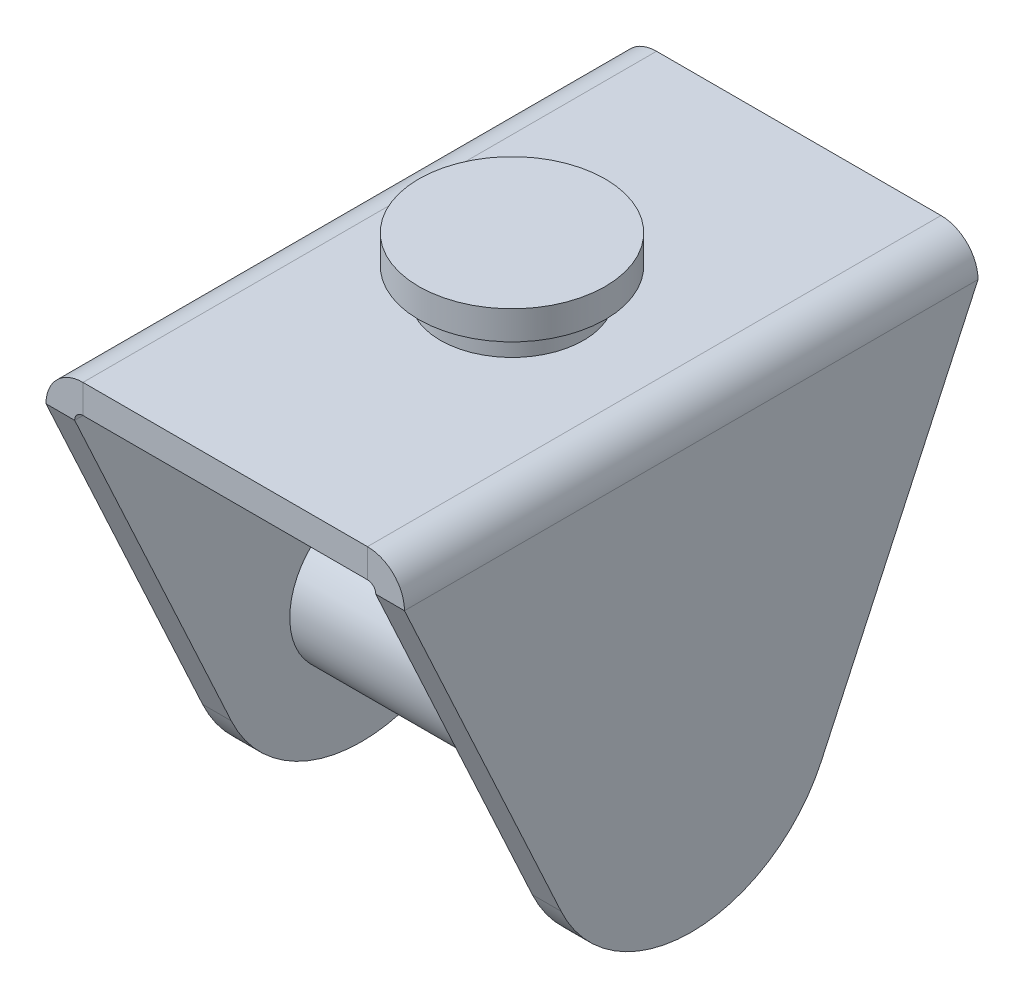
ISO-10303-21;
HEADER;
FILE_DESCRIPTION(('STEP AP214'),'2;1');
FILE_NAME('part.step','',(''),(''),'','','');
FILE_SCHEMA(('AUTOMOTIVE_DESIGN { 1 0 10303 214 1 1 1 1 }'));
ENDSEC;
DATA;
#1=APPLICATION_CONTEXT('core data for automotive mechanical design processes');
#2=APPLICATION_PROTOCOL_DEFINITION('international standard','automotive_design',2000,#1);
#3=PRODUCT_CONTEXT('',#1,'mechanical');
#4=PRODUCT('Part','Part','',(#3));
#5=PRODUCT_RELATED_PRODUCT_CATEGORY('part','',(#4));
#6=PRODUCT_DEFINITION_FORMATION('','',#4);
#7=PRODUCT_DEFINITION_CONTEXT('part definition',#1,'design');
#8=PRODUCT_DEFINITION('design','',#6,#7);
#9=PRODUCT_DEFINITION_SHAPE('','',#8);
#10=(LENGTH_UNIT() NAMED_UNIT(*) SI_UNIT(.MILLI.,.METRE.));
#11=(NAMED_UNIT(*) PLANE_ANGLE_UNIT() SI_UNIT($,.RADIAN.));
#12=(NAMED_UNIT(*) SI_UNIT($,.STERADIAN.) SOLID_ANGLE_UNIT());
#13=UNCERTAINTY_MEASURE_WITH_UNIT(LENGTH_MEASURE(1.E-05),#10,'distance_accuracy_value','');
#14=(GEOMETRIC_REPRESENTATION_CONTEXT(3) GLOBAL_UNCERTAINTY_ASSIGNED_CONTEXT((#13)) GLOBAL_UNIT_ASSIGNED_CONTEXT((#10,
#11,#12)) REPRESENTATION_CONTEXT('',''));
#15=CARTESIAN_POINT('',(0.,0.,0.));
#16=DIRECTION('',(0.,0.,1.));
#17=DIRECTION('',(1.,0.,0.));
#18=AXIS2_PLACEMENT_3D('',#15,#16,#17);
#19=CARTESIAN_POINT('',(15.875,0.,0.));
#20=DIRECTION('',(-1.,0.,0.));
#21=DIRECTION('',(0.,-1.,0.));
#22=AXIS2_PLACEMENT_3D('',#19,#20,#21);
#23=PLANE('',#22);
#24=CARTESIAN_POINT('',(15.8750000000001,-27.94,0.));
#25=DIRECTION('',(1.,0.,0.));
#26=DIRECTION('',(0.,1.,0.));
#27=AXIS2_PLACEMENT_3D('',#24,#25,#26);
#28=CIRCLE('',#27,12.7);
#29=CARTESIAN_POINT('',(15.8750000000001,-33.2713788236344,11.526768837749));
#30=VERTEX_POINT('',#29);
#31=CARTESIAN_POINT('',(15.8750000000001,-33.2713788236344,-11.526768837749));
#32=VERTEX_POINT('',#31);
#33=EDGE_CURVE('E306',#30,#32,#28,.T.);
#34=ORIENTED_EDGE('',*,*,#33,.T.);
#35=DIRECTION('',(0.,0.907619593523546,-0.419793608160191));
#36=VECTOR('',#35,1.);
#37=CARTESIAN_POINT('',(15.875,-10.2551520798875,-22.1722693755687));
#38=LINE('',#37,#36);
#39=CARTESIAN_POINT('',(15.875,-3.27659999999999,-25.4));
#40=VERTEX_POINT('',#39);
#41=EDGE_CURVE('E191',#32,#40,#38,.T.);
#42=ORIENTED_EDGE('',*,*,#41,.T.);
#43=DIRECTION('',(0.,0.,1.));
#44=VECTOR('',#43,1.);
#45=CARTESIAN_POINT('',(15.875,-3.27659999999999,-25.4));
#46=LINE('',#45,#44);
#47=CARTESIAN_POINT('',(15.875,-3.27659999999999,25.4));
#48=VERTEX_POINT('',#47);
#49=EDGE_CURVE('E234',#48,#40,#46,.F.);
#50=ORIENTED_EDGE('',*,*,#49,.F.);
#51=DIRECTION('',(0.,0.907619593523546,0.419793608160192));
#52=VECTOR('',#51,1.);
#53=CARTESIAN_POINT('',(15.875,-10.2551520798875,22.1722693755687));
#54=LINE('',#53,#52);
#55=EDGE_CURVE('E308',#30,#48,#54,.T.);
#56=ORIENTED_EDGE('',*,*,#55,.F.);
#57=EDGE_LOOP('',(#34,#42,#50,#56));
#58=FACE_BOUND('',#57,.T.);
#59=ADVANCED_FACE('F87',(#58),#23,.F.);
#60=CARTESIAN_POINT('',(13.335,0.,0.));
#61=DIRECTION('',(-1.,0.,0.));
#62=DIRECTION('',(0.,-1.,0.));
#63=AXIS2_PLACEMENT_3D('',#60,#61,#62);
#64=PLANE('',#63);
#65=CARTESIAN_POINT('',(13.3350000000001,-27.94,0.));
#66=DIRECTION('',(-1.,0.,0.));
#67=DIRECTION('',(0.,-1.,0.));
#68=AXIS2_PLACEMENT_3D('',#65,#66,#67);
#69=CIRCLE('',#68,6.35);
#70=CARTESIAN_POINT('',(13.3350000000001,-34.29,0.));
#71=VERTEX_POINT('',#70);
#72=EDGE_CURVE('E13',#71,#71,#69,.T.);
#73=ORIENTED_EDGE('',*,*,#72,.F.);
#74=EDGE_LOOP('',(#73));
#75=FACE_BOUND('',#74,.T.);
#76=DIRECTION('',(0.,-0.907619593523546,0.419793608160191));
#77=VECTOR('',#76,1.);
#78=CARTESIAN_POINT('',(13.335,-10.2551520798875,-22.1722693755687));
#79=LINE('',#78,#77);
#80=CARTESIAN_POINT('',(13.335,-3.2766,-25.4));
#81=VERTEX_POINT('',#80);
#82=CARTESIAN_POINT('',(13.335,-33.2713788236345,-11.526768837749));
#83=VERTEX_POINT('',#82);
#84=EDGE_CURVE('E296',#81,#83,#79,.T.);
#85=ORIENTED_EDGE('',*,*,#84,.T.);
#86=CARTESIAN_POINT('',(13.3350000000001,-27.94,0.));
#87=DIRECTION('',(-1.,0.,0.));
#88=DIRECTION('',(0.,-1.,0.));
#89=AXIS2_PLACEMENT_3D('',#86,#87,#88);
#90=CIRCLE('',#89,12.7);
#91=CARTESIAN_POINT('',(13.335,-33.2713788236345,11.526768837749));
#92=VERTEX_POINT('',#91);
#93=EDGE_CURVE('E293',#83,#92,#90,.T.);
#94=ORIENTED_EDGE('',*,*,#93,.T.);
#95=DIRECTION('',(0.,-0.907619593523546,-0.419793608160192));
#96=VECTOR('',#95,1.);
#97=CARTESIAN_POINT('',(13.335,-10.2551520798875,22.1722693755688));
#98=LINE('',#97,#96);
#99=CARTESIAN_POINT('',(13.335,-3.2766,25.4));
#100=VERTEX_POINT('',#99);
#101=EDGE_CURVE('E217',#100,#92,#98,.T.);
#102=ORIENTED_EDGE('',*,*,#101,.F.);
#103=DIRECTION('',(0.,0.,1.));
#104=VECTOR('',#103,1.);
#105=CARTESIAN_POINT('',(13.335,-3.2766,-25.4));
#106=LINE('',#105,#104);
#107=EDGE_CURVE('E240',#81,#100,#106,.T.);
#108=ORIENTED_EDGE('',*,*,#107,.F.);
#109=EDGE_LOOP('',(#85,#94,#102,#108));
#110=FACE_BOUND('',#109,.T.);
#111=ADVANCED_FACE('F366',(#75,#110),#64,.T.);
#112=CARTESIAN_POINT('',(-15.875,0.,0.));
#113=DIRECTION('',(1.,0.,0.));
#114=DIRECTION('',(0.,1.,0.));
#115=AXIS2_PLACEMENT_3D('',#112,#113,#114);
#116=PLANE('',#115);
#117=DIRECTION('',(0.,0.907619593523546,-0.419793608160191));
#118=VECTOR('',#117,1.);
#119=CARTESIAN_POINT('',(-15.8750000000002,-10.2551520798876,-22.1722693755687));
#120=LINE('',#119,#118);
#121=CARTESIAN_POINT('',(-15.8750000000002,-33.2713788236346,-11.526768837749));
#122=VERTEX_POINT('',#121);
#123=CARTESIAN_POINT('',(-15.8750000000003,-3.2766000000001,-25.4));
#124=VERTEX_POINT('',#123);
#125=EDGE_CURVE('E178',#122,#124,#120,.T.);
#126=ORIENTED_EDGE('',*,*,#125,.F.);
#127=CARTESIAN_POINT('',(-15.8750000000002,-27.9400000000001,0.));
#128=DIRECTION('',(1.,0.,0.));
#129=DIRECTION('',(0.,1.,0.));
#130=AXIS2_PLACEMENT_3D('',#127,#128,#129);
#131=CIRCLE('',#130,12.7);
#132=CARTESIAN_POINT('',(-15.8750000000002,-33.2713788236346,11.526768837749));
#133=VERTEX_POINT('',#132);
#134=EDGE_CURVE('E299',#133,#122,#131,.T.);
#135=ORIENTED_EDGE('',*,*,#134,.F.);
#136=DIRECTION('',(0.,0.907619593523546,0.419793608160192));
#137=VECTOR('',#136,1.);
#138=CARTESIAN_POINT('',(-15.8750000000002,-10.2551520798876,22.1722693755687));
#139=LINE('',#138,#137);
#140=CARTESIAN_POINT('',(-15.8750000000003,-3.2766000000001,25.4));
#141=VERTEX_POINT('',#140);
#142=EDGE_CURVE('E212',#133,#141,#139,.T.);
#143=ORIENTED_EDGE('',*,*,#142,.T.);
#144=DIRECTION('',(0.,0.,-1.));
#145=VECTOR('',#144,1.);
#146=CARTESIAN_POINT('',(-15.875,-3.27659999999999,25.4));
#147=LINE('',#146,#145);
#148=EDGE_CURVE('E196',#124,#141,#147,.F.);
#149=ORIENTED_EDGE('',*,*,#148,.F.);
#150=EDGE_LOOP('',(#126,#135,#143,#149));
#151=FACE_BOUND('',#150,.T.);
#152=ADVANCED_FACE('F210',(#151),#116,.F.);
#153=CARTESIAN_POINT('',(-13.335,0.,0.));
#154=DIRECTION('',(1.,0.,0.));
#155=DIRECTION('',(0.,1.,0.));
#156=AXIS2_PLACEMENT_3D('',#153,#154,#155);
#157=PLANE('',#156);
#158=CARTESIAN_POINT('',(-13.3350000000001,-27.9400000000001,0.));
#159=DIRECTION('',(1.,0.,0.));
#160=DIRECTION('',(0.,1.,0.));
#161=AXIS2_PLACEMENT_3D('',#158,#159,#160);
#162=CIRCLE('',#161,6.35);
#163=CARTESIAN_POINT('',(-13.3350000000001,-21.5900000000001,0.));
#164=VERTEX_POINT('',#163);
#165=EDGE_CURVE('E95',#164,#164,#162,.T.);
#166=ORIENTED_EDGE('',*,*,#165,.F.);
#167=EDGE_LOOP('',(#166));
#168=FACE_BOUND('',#167,.T.);
#169=CARTESIAN_POINT('',(-13.3350000000001,-27.9400000000001,0.));
#170=DIRECTION('',(1.,0.,0.));
#171=DIRECTION('',(0.,1.,0.));
#172=AXIS2_PLACEMENT_3D('',#169,#170,#171);
#173=CIRCLE('',#172,12.7);
#174=CARTESIAN_POINT('',(-13.3350000000001,-33.2713788236346,11.526768837749));
#175=VERTEX_POINT('',#174);
#176=CARTESIAN_POINT('',(-13.3350000000001,-33.2713788236346,-11.526768837749));
#177=VERTEX_POINT('',#176);
#178=EDGE_CURVE('E288',#175,#177,#173,.T.);
#179=ORIENTED_EDGE('',*,*,#178,.T.);
#180=DIRECTION('',(0.,0.907619593523546,-0.419793608160191));
#181=VECTOR('',#180,1.);
#182=CARTESIAN_POINT('',(-13.335,-10.2551520798875,-22.1722693755688));
#183=LINE('',#182,#181);
#184=CARTESIAN_POINT('',(-13.335,-3.27660000000009,-25.4));
#185=VERTEX_POINT('',#184);
#186=EDGE_CURVE('E290',#177,#185,#183,.T.);
#187=ORIENTED_EDGE('',*,*,#186,.T.);
#188=DIRECTION('',(0.,0.,-1.));
#189=VECTOR('',#188,1.);
#190=CARTESIAN_POINT('',(-13.335,-3.2766,25.4));
#191=LINE('',#190,#189);
#192=CARTESIAN_POINT('',(-13.3350000000001,-3.27660000000009,25.4));
#193=VERTEX_POINT('',#192);
#194=EDGE_CURVE('E207',#193,#185,#191,.T.);
#195=ORIENTED_EDGE('',*,*,#194,.F.);
#196=DIRECTION('',(0.,0.907619593523546,0.419793608160192));
#197=VECTOR('',#196,1.);
#198=CARTESIAN_POINT('',(-13.335,-10.2551520798876,22.1722693755688));
#199=LINE('',#198,#197);
#200=EDGE_CURVE('E271',#175,#193,#199,.T.);
#201=ORIENTED_EDGE('',*,*,#200,.F.);
#202=EDGE_LOOP('',(#179,#187,#195,#201));
#203=FACE_BOUND('',#202,.T.);
#204=ADVANCED_FACE('F282',(#168,#203),#157,.T.);
#205=CARTESIAN_POINT('',(0.,-2.54,0.));
#206=DIRECTION('',(0.,1.,0.));
#207=DIRECTION('',(0.,0.,1.));
#208=AXIS2_PLACEMENT_3D('',#205,#206,#207);
#209=PLANE('',#208);
#210=DIRECTION('',(0.,0.,-1.));
#211=VECTOR('',#210,1.);
#212=CARTESIAN_POINT('',(-12.5984,-2.54000000000001,-25.4));
#213=LINE('',#212,#211);
#214=CARTESIAN_POINT('',(-12.5984,-2.54000000000001,-25.4));
#215=VERTEX_POINT('',#214);
#216=CARTESIAN_POINT('',(-12.5984,-2.54000000000001,25.4));
#217=VERTEX_POINT('',#216);
#218=EDGE_CURVE('E214',#215,#217,#213,.F.);
#219=ORIENTED_EDGE('',*,*,#218,.F.);
#220=DIRECTION('',(-1.,0.,0.));
#221=VECTOR('',#220,1.);
#222=CARTESIAN_POINT('',(-15.875,-2.54,-25.4));
#223=LINE('',#222,#221);
#224=CARTESIAN_POINT('',(12.5984,-2.54,-25.4));
#225=VERTEX_POINT('',#224);
#226=EDGE_CURVE('E264',#225,#215,#223,.T.);
#227=ORIENTED_EDGE('',*,*,#226,.F.);
#228=DIRECTION('',(0.,0.,1.));
#229=VECTOR('',#228,1.);
#230=CARTESIAN_POINT('',(12.5984,-2.54,25.4));
#231=LINE('',#230,#229);
#232=CARTESIAN_POINT('',(12.5984,-2.54,25.4));
#233=VERTEX_POINT('',#232);
#234=EDGE_CURVE('E255',#233,#225,#231,.F.);
#235=ORIENTED_EDGE('',*,*,#234,.F.);
#236=DIRECTION('',(1.,0.,0.));
#237=VECTOR('',#236,1.);
#238=CARTESIAN_POINT('',(-15.875,-2.54,25.4));
#239=LINE('',#238,#237);
#240=EDGE_CURVE('E267',#217,#233,#239,.T.);
#241=ORIENTED_EDGE('',*,*,#240,.F.);
#242=EDGE_LOOP('',(#219,#227,#235,#241));
#243=FACE_BOUND('',#242,.T.);
#244=ADVANCED_FACE('F285',(#243),#209,.F.);
#245=CARTESIAN_POINT('',(0.,0.,0.));
#246=DIRECTION('',(0.,1.,0.));
#247=DIRECTION('',(0.,0.,1.));
#248=AXIS2_PLACEMENT_3D('',#245,#246,#247);
#249=PLANE('',#248);
#250=CARTESIAN_POINT('',(0.,0.,0.));
#251=DIRECTION('',(0.,1.,0.));
#252=DIRECTION('',(0.,0.,1.));
#253=AXIS2_PLACEMENT_3D('',#250,#251,#252);
#254=CIRCLE('',#253,6.35);
#255=CARTESIAN_POINT('',(0.,0.,6.35));
#256=VERTEX_POINT('',#255);
#257=EDGE_CURVE('E608',#256,#256,#254,.T.);
#258=ORIENTED_EDGE('',*,*,#257,.F.);
#259=EDGE_LOOP('',(#258));
#260=FACE_BOUND('',#259,.T.);
#261=DIRECTION('',(-1.,0.,0.));
#262=VECTOR('',#261,1.);
#263=CARTESIAN_POINT('',(-15.875,0.,-25.4));
#264=LINE('',#263,#262);
#265=CARTESIAN_POINT('',(12.5984,0.,-25.4));
#266=VERTEX_POINT('',#265);
#267=CARTESIAN_POINT('',(-12.5984,0.,-25.4));
#268=VERTEX_POINT('',#267);
#269=EDGE_CURVE('E261',#266,#268,#264,.T.);
#270=ORIENTED_EDGE('',*,*,#269,.T.);
#271=DIRECTION('',(0.,0.,-1.));
#272=VECTOR('',#271,1.);
#273=CARTESIAN_POINT('',(-12.5984,0.,-25.4));
#274=LINE('',#273,#272);
#275=CARTESIAN_POINT('',(-12.5984,0.,25.4));
#276=VERTEX_POINT('',#275);
#277=EDGE_CURVE('E198',#268,#276,#274,.F.);
#278=ORIENTED_EDGE('',*,*,#277,.T.);
#279=DIRECTION('',(1.,0.,0.));
#280=VECTOR('',#279,1.);
#281=CARTESIAN_POINT('',(-15.875,0.,25.4));
#282=LINE('',#281,#280);
#283=CARTESIAN_POINT('',(12.5984,0.,25.4));
#284=VERTEX_POINT('',#283);
#285=EDGE_CURVE('E268',#276,#284,#282,.T.);
#286=ORIENTED_EDGE('',*,*,#285,.T.);
#287=DIRECTION('',(0.,0.,1.));
#288=VECTOR('',#287,1.);
#289=CARTESIAN_POINT('',(12.5984,0.,25.4));
#290=LINE('',#289,#288);
#291=EDGE_CURVE('E244',#284,#266,#290,.F.);
#292=ORIENTED_EDGE('',*,*,#291,.T.);
#293=EDGE_LOOP('',(#270,#278,#286,#292));
#294=FACE_BOUND('',#293,.T.);
#295=ADVANCED_FACE('F353',(#260,#294),#249,.T.);
#296=CARTESIAN_POINT('',(-15.875,-2.54,-25.4));
#297=DIRECTION('',(0.,0.,-1.));
#298=DIRECTION('',(-1.,0.,0.));
#299=AXIS2_PLACEMENT_3D('',#296,#297,#298);
#300=PLANE('',#299);
#301=ORIENTED_EDGE('',*,*,#226,.T.);
#302=DIRECTION('',(0.,1.,0.));
#303=VECTOR('',#302,1.);
#304=CARTESIAN_POINT('',(-12.5984,-2.54000000000001,-25.4));
#305=LINE('',#304,#303);
#306=EDGE_CURVE('E225',#215,#268,#305,.T.);
#307=ORIENTED_EDGE('',*,*,#306,.T.);
#308=ORIENTED_EDGE('',*,*,#269,.F.);
#309=DIRECTION('',(0.,1.,0.));
#310=VECTOR('',#309,1.);
#311=CARTESIAN_POINT('',(12.5984,-2.54,-25.4));
#312=LINE('',#311,#310);
#313=EDGE_CURVE('E259',#225,#266,#312,.T.);
#314=ORIENTED_EDGE('',*,*,#313,.F.);
#315=EDGE_LOOP('',(#301,#307,#308,#314));
#316=FACE_BOUND('',#315,.T.);
#317=ADVANCED_FACE('F89',(#316),#300,.T.);
#318=CARTESIAN_POINT('',(-15.875,-2.54,25.4));
#319=DIRECTION('',(0.,0.,1.));
#320=DIRECTION('',(1.,0.,0.));
#321=AXIS2_PLACEMENT_3D('',#318,#319,#320);
#322=PLANE('',#321);
#323=DIRECTION('',(0.,1.,0.));
#324=VECTOR('',#323,1.);
#325=CARTESIAN_POINT('',(-12.5984,-2.54000000000001,25.4));
#326=LINE('',#325,#324);
#327=EDGE_CURVE('E230',#217,#276,#326,.T.);
#328=ORIENTED_EDGE('',*,*,#327,.F.);
#329=ORIENTED_EDGE('',*,*,#240,.T.);
#330=DIRECTION('',(0.,1.,0.));
#331=VECTOR('',#330,1.);
#332=CARTESIAN_POINT('',(12.5984,-2.54,25.4));
#333=LINE('',#332,#331);
#334=EDGE_CURVE('E249',#233,#284,#333,.T.);
#335=ORIENTED_EDGE('',*,*,#334,.T.);
#336=ORIENTED_EDGE('',*,*,#285,.F.);
#337=EDGE_LOOP('',(#328,#329,#335,#336));
#338=FACE_BOUND('',#337,.T.);
#339=ADVANCED_FACE('F341',(#338),#322,.T.);
#340=CARTESIAN_POINT('',(12.5984,-3.2766,-25.4));
#341=DIRECTION('',(0.,0.,-1.));
#342=DIRECTION('',(-1.,0.,0.));
#343=AXIS2_PLACEMENT_3D('',#340,#341,#342);
#344=PLANE('',#343);
#345=DIRECTION('',(-1.,0.,0.));
#346=VECTOR('',#345,1.);
#347=CARTESIAN_POINT('',(15.875,-3.27659999999999,-25.4));
#348=LINE('',#347,#346);
#349=EDGE_CURVE('E232',#81,#40,#348,.F.);
#350=ORIENTED_EDGE('',*,*,#349,.F.);
#351=CARTESIAN_POINT('',(12.5984,-3.2766,-25.4));
#352=DIRECTION('',(0.,0.,1.));
#353=DIRECTION('',(1.,0.,0.));
#354=AXIS2_PLACEMENT_3D('',#351,#352,#353);
#355=CIRCLE('',#354,0.736599999999999);
#356=EDGE_CURVE('E252',#225,#81,#355,.F.);
#357=ORIENTED_EDGE('',*,*,#356,.F.);
#358=ORIENTED_EDGE('',*,*,#313,.T.);
#359=CARTESIAN_POINT('',(12.5984,-3.2766,-25.4));
#360=DIRECTION('',(0.,0.,1.));
#361=DIRECTION('',(1.,0.,0.));
#362=AXIS2_PLACEMENT_3D('',#359,#360,#361);
#363=CIRCLE('',#362,3.2766);
#364=EDGE_CURVE('E102',#266,#40,#363,.F.);
#365=ORIENTED_EDGE('',*,*,#364,.T.);
#366=EDGE_LOOP('',(#350,#357,#358,#365));
#367=FACE_BOUND('',#366,.T.);
#368=ADVANCED_FACE('F351',(#367),#344,.T.);
#369=CARTESIAN_POINT('',(12.5984,-3.2766,25.4));
#370=DIRECTION('',(0.,0.,-1.));
#371=DIRECTION('',(-1.,0.,0.));
#372=AXIS2_PLACEMENT_3D('',#369,#370,#371);
#373=PLANE('',#372);
#374=CARTESIAN_POINT('',(12.5984,-3.2766,25.4));
#375=DIRECTION('',(0.,0.,1.));
#376=DIRECTION('',(1.,0.,0.));
#377=AXIS2_PLACEMENT_3D('',#374,#375,#376);
#378=CIRCLE('',#377,0.736599999999999);
#379=EDGE_CURVE('E236',#100,#233,#378,.T.);
#380=ORIENTED_EDGE('',*,*,#379,.F.);
#381=DIRECTION('',(-1.,0.,0.));
#382=VECTOR('',#381,1.);
#383=CARTESIAN_POINT('',(13.335,-3.2766,25.4));
#384=LINE('',#383,#382);
#385=EDGE_CURVE('E237',#100,#48,#384,.F.);
#386=ORIENTED_EDGE('',*,*,#385,.T.);
#387=CARTESIAN_POINT('',(12.5984,-3.2766,25.4));
#388=DIRECTION('',(0.,0.,1.));
#389=DIRECTION('',(1.,0.,0.));
#390=AXIS2_PLACEMENT_3D('',#387,#388,#389);
#391=CIRCLE('',#390,3.2766);
#392=EDGE_CURVE('E247',#48,#284,#391,.T.);
#393=ORIENTED_EDGE('',*,*,#392,.T.);
#394=ORIENTED_EDGE('',*,*,#334,.F.);
#395=EDGE_LOOP('',(#380,#386,#393,#394));
#396=FACE_BOUND('',#395,.T.);
#397=ADVANCED_FACE('F333',(#396),#373,.F.);
#398=CARTESIAN_POINT('',(12.5984,-3.2766,25.4));
#399=DIRECTION('',(0.,0.,1.));
#400=DIRECTION('',(1.,0.,0.));
#401=AXIS2_PLACEMENT_3D('',#398,#399,#400);
#402=CYLINDRICAL_SURFACE('',#401,3.2766);
#403=ORIENTED_EDGE('',*,*,#291,.F.);
#404=ORIENTED_EDGE('',*,*,#392,.F.);
#405=ORIENTED_EDGE('',*,*,#49,.T.);
#406=ORIENTED_EDGE('',*,*,#364,.F.);
#407=EDGE_LOOP('',(#403,#404,#405,#406));
#408=FACE_BOUND('',#407,.T.);
#409=ADVANCED_FACE('F330',(#408),#402,.T.);
#410=CARTESIAN_POINT('',(12.5984,-3.2766,25.4));
#411=DIRECTION('',(0.,0.,1.));
#412=DIRECTION('',(1.,0.,0.));
#413=AXIS2_PLACEMENT_3D('',#410,#411,#412);
#414=CYLINDRICAL_SURFACE('',#413,0.736599999999999);
#415=ORIENTED_EDGE('',*,*,#234,.T.);
#416=ORIENTED_EDGE('',*,*,#356,.T.);
#417=ORIENTED_EDGE('',*,*,#107,.T.);
#418=ORIENTED_EDGE('',*,*,#379,.T.);
#419=EDGE_LOOP('',(#415,#416,#417,#418));
#420=FACE_BOUND('',#419,.T.);
#421=ADVANCED_FACE('F335',(#420),#414,.F.);
#422=CARTESIAN_POINT('',(-12.5984,-3.27660000000001,25.4));
#423=DIRECTION('',(0.,0.,1.));
#424=DIRECTION('',(1.,0.,0.));
#425=AXIS2_PLACEMENT_3D('',#422,#423,#424);
#426=PLANE('',#425);
#427=DIRECTION('',(1.,0.,0.));
#428=VECTOR('',#427,1.);
#429=CARTESIAN_POINT('',(-15.875,-3.27659999999999,25.4));
#430=LINE('',#429,#428);
#431=EDGE_CURVE('E222',#193,#141,#430,.F.);
#432=ORIENTED_EDGE('',*,*,#431,.F.);
#433=CARTESIAN_POINT('',(-12.5984,-3.27660000000001,25.4));
#434=DIRECTION('',(0.,0.,-1.));
#435=DIRECTION('',(-1.,0.,0.));
#436=AXIS2_PLACEMENT_3D('',#433,#434,#435);
#437=CIRCLE('',#436,0.736599999999999);
#438=EDGE_CURVE('E201',#217,#193,#437,.F.);
#439=ORIENTED_EDGE('',*,*,#438,.F.);
#440=ORIENTED_EDGE('',*,*,#327,.T.);
#441=CARTESIAN_POINT('',(-12.5984,-3.27660000000001,25.4));
#442=DIRECTION('',(0.,0.,-1.));
#443=DIRECTION('',(-1.,0.,0.));
#444=AXIS2_PLACEMENT_3D('',#441,#442,#443);
#445=CIRCLE('',#444,3.2766);
#446=EDGE_CURVE('E110',#276,#141,#445,.F.);
#447=ORIENTED_EDGE('',*,*,#446,.T.);
#448=EDGE_LOOP('',(#432,#439,#440,#447));
#449=FACE_BOUND('',#448,.T.);
#450=ADVANCED_FACE('F382',(#449),#426,.T.);
#451=CARTESIAN_POINT('',(-12.5984,-3.27660000000001,-25.4));
#452=DIRECTION('',(0.,0.,1.));
#453=DIRECTION('',(1.,0.,0.));
#454=AXIS2_PLACEMENT_3D('',#451,#452,#453);
#455=PLANE('',#454);
#456=CARTESIAN_POINT('',(-12.5984,-3.27660000000001,-25.4));
#457=DIRECTION('',(0.,0.,-1.));
#458=DIRECTION('',(-1.,0.,0.));
#459=AXIS2_PLACEMENT_3D('',#456,#457,#458);
#460=CIRCLE('',#459,0.736599999999999);
#461=EDGE_CURVE('E206',#185,#215,#460,.T.);
#462=ORIENTED_EDGE('',*,*,#461,.F.);
#463=DIRECTION('',(1.,0.,0.));
#464=VECTOR('',#463,1.);
#465=CARTESIAN_POINT('',(-13.335,-3.2766,-25.4));
#466=LINE('',#465,#464);
#467=EDGE_CURVE('E183',#185,#124,#466,.F.);
#468=ORIENTED_EDGE('',*,*,#467,.T.);
#469=CARTESIAN_POINT('',(-12.5984,-3.27660000000001,-25.4));
#470=DIRECTION('',(0.,0.,-1.));
#471=DIRECTION('',(-1.,0.,0.));
#472=AXIS2_PLACEMENT_3D('',#469,#470,#471);
#473=CIRCLE('',#472,3.2766);
#474=EDGE_CURVE('E194',#124,#268,#473,.T.);
#475=ORIENTED_EDGE('',*,*,#474,.T.);
#476=ORIENTED_EDGE('',*,*,#306,.F.);
#477=EDGE_LOOP('',(#462,#468,#475,#476));
#478=FACE_BOUND('',#477,.T.);
#479=ADVANCED_FACE('F204',(#478),#455,.F.);
#480=CARTESIAN_POINT('',(-12.5984,-3.27660000000001,-25.4));
#481=DIRECTION('',(0.,0.,-1.));
#482=DIRECTION('',(-1.,0.,0.));
#483=AXIS2_PLACEMENT_3D('',#480,#481,#482);
#484=CYLINDRICAL_SURFACE('',#483,3.2766);
#485=ORIENTED_EDGE('',*,*,#277,.F.);
#486=ORIENTED_EDGE('',*,*,#474,.F.);
#487=ORIENTED_EDGE('',*,*,#148,.T.);
#488=ORIENTED_EDGE('',*,*,#446,.F.);
#489=EDGE_LOOP('',(#485,#486,#487,#488));
#490=FACE_BOUND('',#489,.T.);
#491=ADVANCED_FACE('F195',(#490),#484,.T.);
#492=CARTESIAN_POINT('',(-12.5984,-3.27660000000001,-25.4));
#493=DIRECTION('',(0.,0.,-1.));
#494=DIRECTION('',(-1.,0.,0.));
#495=AXIS2_PLACEMENT_3D('',#492,#493,#494);
#496=CYLINDRICAL_SURFACE('',#495,0.736599999999999);
#497=ORIENTED_EDGE('',*,*,#218,.T.);
#498=ORIENTED_EDGE('',*,*,#438,.T.);
#499=ORIENTED_EDGE('',*,*,#194,.T.);
#500=ORIENTED_EDGE('',*,*,#461,.T.);
#501=EDGE_LOOP('',(#497,#498,#499,#500));
#502=FACE_BOUND('',#501,.T.);
#503=ADVANCED_FACE('F420',(#502),#496,.F.);
#504=CARTESIAN_POINT('',(-15.8750000000002,-27.9400000000001,0.));
#505=DIRECTION('',(1.,0.,0.));
#506=DIRECTION('',(0.,1.,0.));
#507=AXIS2_PLACEMENT_3D('',#504,#505,#506);
#508=CYLINDRICAL_SURFACE('',#507,12.7);
#509=DIRECTION('',(1.,0.,0.));
#510=VECTOR('',#509,1.);
#511=CARTESIAN_POINT('',(-15.8750000000002,-33.2713788236346,11.526768837749));
#512=LINE('',#511,#510);
#513=EDGE_CURVE('E294',#133,#175,#512,.T.);
#514=ORIENTED_EDGE('',*,*,#513,.F.);
#515=ORIENTED_EDGE('',*,*,#134,.T.);
#516=DIRECTION('',(1.,0.,0.));
#517=VECTOR('',#516,1.);
#518=CARTESIAN_POINT('',(-15.8750000000002,-33.2713788236346,-11.526768837749));
#519=LINE('',#518,#517);
#520=EDGE_CURVE('E186',#122,#177,#519,.T.);
#521=ORIENTED_EDGE('',*,*,#520,.T.);
#522=ORIENTED_EDGE('',*,*,#178,.F.);
#523=EDGE_LOOP('',(#514,#515,#521,#522));
#524=FACE_BOUND('',#523,.T.);
#525=ADVANCED_FACE('F298',(#524),#508,.T.);
#526=CARTESIAN_POINT('',(-15.8750000000002,-10.2551520798876,22.1722693755687));
#527=DIRECTION('',(0.,0.419793608160192,-0.907619593523546));
#528=DIRECTION('',(0.,0.907619593523546,0.419793608160192));
#529=AXIS2_PLACEMENT_3D('',#526,#527,#528);
#530=PLANE('',#529);
#531=ORIENTED_EDGE('',*,*,#200,.T.);
#532=ORIENTED_EDGE('',*,*,#431,.T.);
#533=ORIENTED_EDGE('',*,*,#142,.F.);
#534=ORIENTED_EDGE('',*,*,#513,.T.);
#535=EDGE_LOOP('',(#531,#532,#533,#534));
#536=FACE_BOUND('',#535,.T.);
#537=ADVANCED_FACE('F439',(#536),#530,.F.);
#538=ORIENTED_EDGE('',*,*,#101,.T.);
#539=EDGE_CURVE('E310',#92,#30,#512,.T.);
#540=ORIENTED_EDGE('',*,*,#539,.T.);
#541=ORIENTED_EDGE('',*,*,#55,.T.);
#542=ORIENTED_EDGE('',*,*,#385,.F.);
#543=EDGE_LOOP('',(#538,#540,#541,#542));
#544=FACE_BOUND('',#543,.T.);
#545=ADVANCED_FACE('F318',(#544),#530,.F.);
#546=ORIENTED_EDGE('',*,*,#93,.F.);
#547=EDGE_CURVE('E190',#83,#32,#519,.T.);
#548=ORIENTED_EDGE('',*,*,#547,.T.);
#549=ORIENTED_EDGE('',*,*,#33,.F.);
#550=ORIENTED_EDGE('',*,*,#539,.F.);
#551=EDGE_LOOP('',(#546,#548,#549,#550));
#552=FACE_BOUND('',#551,.T.);
#553=ADVANCED_FACE('F322',(#552),#508,.T.);
#554=CARTESIAN_POINT('',(-15.8750000000002,-10.2551520798876,-22.1722693755687));
#555=DIRECTION('',(0.,-0.419793608160191,-0.907619593523546));
#556=DIRECTION('',(0.,0.907619593523546,-0.419793608160191));
#557=AXIS2_PLACEMENT_3D('',#554,#555,#556);
#558=PLANE('',#557);
#559=ORIENTED_EDGE('',*,*,#349,.T.);
#560=ORIENTED_EDGE('',*,*,#41,.F.);
#561=ORIENTED_EDGE('',*,*,#547,.F.);
#562=ORIENTED_EDGE('',*,*,#84,.F.);
#563=EDGE_LOOP('',(#559,#560,#561,#562));
#564=FACE_BOUND('',#563,.T.);
#565=ADVANCED_FACE('F471',(#564),#558,.T.);
#566=ORIENTED_EDGE('',*,*,#520,.F.);
#567=ORIENTED_EDGE('',*,*,#125,.T.);
#568=ORIENTED_EDGE('',*,*,#467,.F.);
#569=ORIENTED_EDGE('',*,*,#186,.F.);
#570=EDGE_LOOP('',(#566,#567,#568,#569));
#571=FACE_BOUND('',#570,.T.);
#572=ADVANCED_FACE('F180',(#571),#558,.T.);
#573=CARTESIAN_POINT('',(-14.6049999999999,-27.9400000000001,0.));
#574=DIRECTION('',(1.,0.,0.));
#575=DIRECTION('',(0.,1.,0.));
#576=AXIS2_PLACEMENT_3D('',#573,#574,#575);
#577=CYLINDRICAL_SURFACE('',#576,6.35);
#578=ORIENTED_EDGE('',*,*,#165,.T.);
#579=EDGE_LOOP('',(#578));
#580=FACE_BOUND('',#579,.T.);
#581=ORIENTED_EDGE('',*,*,#72,.T.);
#582=EDGE_LOOP('',(#581));
#583=FACE_BOUND('',#582,.T.);
#584=ADVANCED_FACE('F279',(#580,#583),#577,.T.);
#585=CARTESIAN_POINT('',(0.,2.54,0.));
#586=DIRECTION('',(0.,-1.,0.));
#587=DIRECTION('',(0.,0.,-1.));
#588=AXIS2_PLACEMENT_3D('',#585,#586,#587);
#589=CYLINDRICAL_SURFACE('',#588,6.35);
#590=CARTESIAN_POINT('',(0.,2.54,0.));
#591=DIRECTION('',(0.,1.,0.));
#592=DIRECTION('',(0.,0.,1.));
#593=AXIS2_PLACEMENT_3D('',#590,#591,#592);
#594=CIRCLE('',#593,6.35);
#595=CARTESIAN_POINT('',(0.,2.54,6.35));
#596=VERTEX_POINT('',#595);
#597=EDGE_CURVE('E600',#596,#596,#594,.T.);
#598=ORIENTED_EDGE('',*,*,#597,.F.);
#599=EDGE_LOOP('',(#598));
#600=FACE_BOUND('',#599,.T.);
#601=ORIENTED_EDGE('',*,*,#257,.T.);
#602=EDGE_LOOP('',(#601));
#603=FACE_BOUND('',#602,.T.);
#604=ADVANCED_FACE('F506',(#600,#603),#589,.T.);
#605=CARTESIAN_POINT('',(0.,5.08,0.));
#606=DIRECTION('',(0.,-1.,0.));
#607=DIRECTION('',(0.,0.,-1.));
#608=AXIS2_PLACEMENT_3D('',#605,#606,#607);
#609=CYLINDRICAL_SURFACE('',#608,8.255);
#610=CARTESIAN_POINT('',(0.,5.08,0.));
#611=DIRECTION('',(0.,1.,0.));
#612=DIRECTION('',(0.,0.,1.));
#613=AXIS2_PLACEMENT_3D('',#610,#611,#612);
#614=CIRCLE('',#613,8.255);
#615=CARTESIAN_POINT('',(0.,5.08,8.255));
#616=VERTEX_POINT('',#615);
#617=EDGE_CURVE('E605',#616,#616,#614,.T.);
#618=ORIENTED_EDGE('',*,*,#617,.F.);
#619=EDGE_LOOP('',(#618));
#620=FACE_BOUND('',#619,.T.);
#621=CARTESIAN_POINT('',(0.,2.54,0.));
#622=DIRECTION('',(0.,1.,0.));
#623=DIRECTION('',(0.,0.,1.));
#624=AXIS2_PLACEMENT_3D('',#621,#622,#623);
#625=CIRCLE('',#624,8.255);
#626=CARTESIAN_POINT('',(0.,2.54,8.255));
#627=VERTEX_POINT('',#626);
#628=EDGE_CURVE('E603',#627,#627,#625,.T.);
#629=ORIENTED_EDGE('',*,*,#628,.T.);
#630=EDGE_LOOP('',(#629));
#631=FACE_BOUND('',#630,.T.);
#632=ADVANCED_FACE('F514',(#620,#631),#609,.T.);
#633=CARTESIAN_POINT('',(0.,5.08,0.));
#634=DIRECTION('',(0.,1.,0.));
#635=DIRECTION('',(0.,0.,1.));
#636=AXIS2_PLACEMENT_3D('',#633,#634,#635);
#637=PLANE('',#636);
#638=ORIENTED_EDGE('',*,*,#617,.T.);
#639=EDGE_LOOP('',(#638));
#640=FACE_BOUND('',#639,.T.);
#641=ADVANCED_FACE('F522',(#640),#637,.T.);
#642=CARTESIAN_POINT('',(0.,2.54,0.));
#643=DIRECTION('',(0.,1.,0.));
#644=DIRECTION('',(0.,0.,1.));
#645=AXIS2_PLACEMENT_3D('',#642,#643,#644);
#646=PLANE('',#645);
#647=ORIENTED_EDGE('',*,*,#597,.T.);
#648=EDGE_LOOP('',(#647));
#649=FACE_BOUND('',#648,.T.);
#650=ORIENTED_EDGE('',*,*,#628,.F.);
#651=EDGE_LOOP('',(#650));
#652=FACE_BOUND('',#651,.T.);
#653=ADVANCED_FACE('F530',(#649,#652),#646,.F.);
#654=CLOSED_SHELL('',(#59,#111,#152,#204,#244,#295,#317,#339,#368,#397,#409,#421,#450,#479,#491,
#503,#525,#537,#545,#553,#565,#572,#584,#604,#632,#641,#653));
#655=MANIFOLD_SOLID_BREP('B2',#654);
#656=ADVANCED_BREP_SHAPE_REPRESENTATION('',(#18,#655),#14);
#657=SHAPE_DEFINITION_REPRESENTATION(#9,#656);
ENDSEC;
END-ISO-10303-21;
